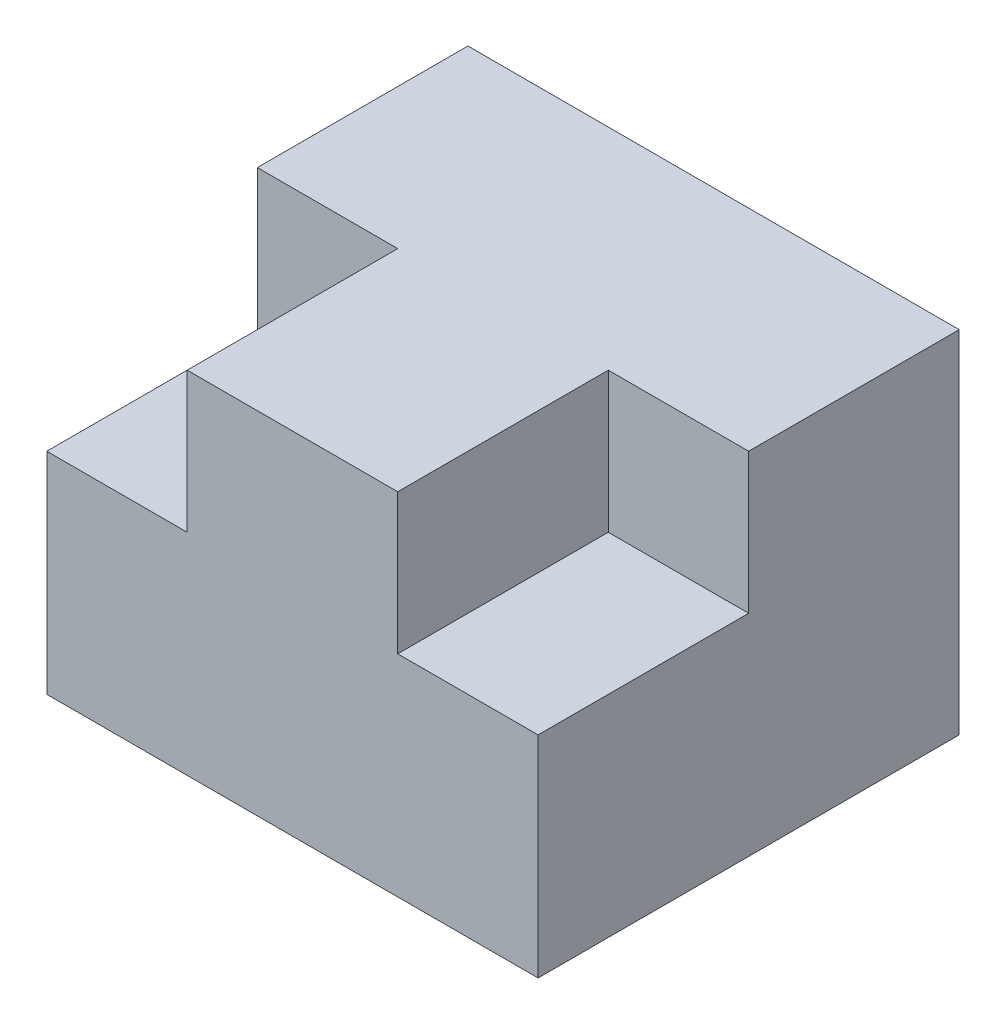
ISO-10303-21;
HEADER;
FILE_DESCRIPTION(('STEP AP214'),'2;1');
FILE_NAME('part.step','',(''),(''),'','','');
FILE_SCHEMA(('AUTOMOTIVE_DESIGN { 1 0 10303 214 1 1 1 1 }'));
ENDSEC;
DATA;
#1=APPLICATION_CONTEXT('core data for automotive mechanical design processes');
#2=APPLICATION_PROTOCOL_DEFINITION('international standard','automotive_design',2000,#1);
#3=PRODUCT_CONTEXT('',#1,'mechanical');
#4=PRODUCT('Part','Part','',(#3));
#5=PRODUCT_RELATED_PRODUCT_CATEGORY('part','',(#4));
#6=PRODUCT_DEFINITION_FORMATION('','',#4);
#7=PRODUCT_DEFINITION_CONTEXT('part definition',#1,'design');
#8=PRODUCT_DEFINITION('design','',#6,#7);
#9=PRODUCT_DEFINITION_SHAPE('','',#8);
#10=(LENGTH_UNIT() NAMED_UNIT(*) SI_UNIT(.MILLI.,.METRE.));
#11=(NAMED_UNIT(*) PLANE_ANGLE_UNIT() SI_UNIT($,.RADIAN.));
#12=(NAMED_UNIT(*) SI_UNIT($,.STERADIAN.) SOLID_ANGLE_UNIT());
#13=UNCERTAINTY_MEASURE_WITH_UNIT(LENGTH_MEASURE(1.E-05),#10,'distance_accuracy_value','');
#14=(GEOMETRIC_REPRESENTATION_CONTEXT(3) GLOBAL_UNCERTAINTY_ASSIGNED_CONTEXT((#13)) GLOBAL_UNIT_ASSIGNED_CONTEXT((#10,
#11,#12)) REPRESENTATION_CONTEXT('',''));
#15=CARTESIAN_POINT('',(0.,0.,0.));
#16=DIRECTION('',(0.,0.,1.));
#17=DIRECTION('',(1.,0.,0.));
#18=AXIS2_PLACEMENT_3D('',#15,#16,#17);
#19=CARTESIAN_POINT('',(0.,15.,15.));
#20=DIRECTION('',(0.,-1.,0.));
#21=DIRECTION('',(1.,0.,0.));
#22=AXIS2_PLACEMENT_3D('',#19,#20,#21);
#23=PLANE('',#22);
#24=DIRECTION('',(-1.,0.,0.));
#25=VECTOR('',#24,1.);
#26=CARTESIAN_POINT('',(0.,15.,0.));
#27=LINE('',#26,#25);
#28=CARTESIAN_POINT('',(10.,15.,0.));
#29=VERTEX_POINT('',#28);
#30=CARTESIAN_POINT('',(0.,15.,0.));
#31=VERTEX_POINT('',#30);
#32=EDGE_CURVE('E162',#29,#31,#27,.T.);
#33=ORIENTED_EDGE('',*,*,#32,.T.);
#34=DIRECTION('',(0.,0.,-1.));
#35=VECTOR('',#34,1.);
#36=CARTESIAN_POINT('',(0.,15.,15.));
#37=LINE('',#36,#35);
#38=CARTESIAN_POINT('',(0.,15.,15.));
#39=VERTEX_POINT('',#38);
#40=EDGE_CURVE('E11',#39,#31,#37,.T.);
#41=ORIENTED_EDGE('',*,*,#40,.F.);
#42=DIRECTION('',(-1.,0.,0.));
#43=VECTOR('',#42,1.);
#44=CARTESIAN_POINT('',(0.,15.,15.));
#45=LINE('',#44,#43);
#46=CARTESIAN_POINT('',(10.,15.,15.));
#47=VERTEX_POINT('',#46);
#48=EDGE_CURVE('E164',#47,#39,#45,.T.);
#49=ORIENTED_EDGE('',*,*,#48,.F.);
#50=DIRECTION('',(0.,0.,-1.));
#51=VECTOR('',#50,1.);
#52=CARTESIAN_POINT('',(10.,15.,15.));
#53=LINE('',#52,#51);
#54=EDGE_CURVE('E188',#47,#29,#53,.T.);
#55=ORIENTED_EDGE('',*,*,#54,.T.);
#56=EDGE_LOOP('',(#33,#41,#49,#55));
#57=FACE_BOUND('',#56,.T.);
#58=ADVANCED_FACE('F43',(#57),#23,.F.);
#59=CARTESIAN_POINT('',(0.,0.,15.));
#60=DIRECTION('',(1.,0.,0.));
#61=DIRECTION('',(0.,1.,0.));
#62=AXIS2_PLACEMENT_3D('',#59,#60,#61);
#63=PLANE('',#62);
#64=ORIENTED_EDGE('',*,*,#40,.T.);
#65=DIRECTION('',(0.,-1.,0.));
#66=VECTOR('',#65,1.);
#67=CARTESIAN_POINT('',(0.,0.,0.));
#68=LINE('',#67,#66);
#69=CARTESIAN_POINT('',(0.,25.,0.));
#70=VERTEX_POINT('',#69);
#71=EDGE_CURVE('E122',#70,#31,#68,.T.);
#72=ORIENTED_EDGE('',*,*,#71,.F.);
#73=DIRECTION('',(0.,0.,1.));
#74=VECTOR('',#73,1.);
#75=CARTESIAN_POINT('',(0.,25.,-15.));
#76=LINE('',#75,#74);
#77=CARTESIAN_POINT('',(0.,25.,-15.));
#78=VERTEX_POINT('',#77);
#79=EDGE_CURVE('E116',#78,#70,#76,.T.);
#80=ORIENTED_EDGE('',*,*,#79,.F.);
#81=DIRECTION('',(0.,-1.,0.));
#82=VECTOR('',#81,1.);
#83=CARTESIAN_POINT('',(0.,0.,-15.));
#84=LINE('',#83,#82);
#85=CARTESIAN_POINT('',(0.,0.,-15.));
#86=VERTEX_POINT('',#85);
#87=EDGE_CURVE('E121',#78,#86,#84,.T.);
#88=ORIENTED_EDGE('',*,*,#87,.T.);
#89=DIRECTION('',(0.,0.,-1.));
#90=VECTOR('',#89,1.);
#91=CARTESIAN_POINT('',(0.,0.,15.));
#92=LINE('',#91,#90);
#93=CARTESIAN_POINT('',(0.,0.,15.));
#94=VERTEX_POINT('',#93);
#95=EDGE_CURVE('E52',#94,#86,#92,.T.);
#96=ORIENTED_EDGE('',*,*,#95,.F.);
#97=DIRECTION('',(0.,-1.,0.));
#98=VECTOR('',#97,1.);
#99=CARTESIAN_POINT('',(0.,0.,15.));
#100=LINE('',#99,#98);
#101=EDGE_CURVE('E167',#39,#94,#100,.T.);
#102=ORIENTED_EDGE('',*,*,#101,.F.);
#103=EDGE_LOOP('',(#64,#72,#80,#88,#96,#102));
#104=FACE_BOUND('',#103,.T.);
#105=ADVANCED_FACE('F118',(#104),#63,.F.);
#106=CARTESIAN_POINT('',(0.,0.,15.));
#107=DIRECTION('',(0.,1.,0.));
#108=DIRECTION('',(0.,0.,1.));
#109=AXIS2_PLACEMENT_3D('',#106,#107,#108);
#110=PLANE('',#109);
#111=ORIENTED_EDGE('',*,*,#95,.T.);
#112=DIRECTION('',(1.,0.,0.));
#113=VECTOR('',#112,1.);
#114=CARTESIAN_POINT('',(0.,0.,-15.));
#115=LINE('',#114,#113);
#116=CARTESIAN_POINT('',(35.,0.,-15.));
#117=VERTEX_POINT('',#116);
#118=EDGE_CURVE('E144',#86,#117,#115,.T.);
#119=ORIENTED_EDGE('',*,*,#118,.T.);
#120=DIRECTION('',(0.,0.,-1.));
#121=VECTOR('',#120,1.);
#122=CARTESIAN_POINT('',(35.,0.,15.));
#123=LINE('',#122,#121);
#124=CARTESIAN_POINT('',(35.,0.,15.));
#125=VERTEX_POINT('',#124);
#126=EDGE_CURVE('E221',#125,#117,#123,.T.);
#127=ORIENTED_EDGE('',*,*,#126,.F.);
#128=DIRECTION('',(1.,0.,0.));
#129=VECTOR('',#128,1.);
#130=CARTESIAN_POINT('',(0.,0.,15.));
#131=LINE('',#130,#129);
#132=EDGE_CURVE('E171',#94,#125,#131,.T.);
#133=ORIENTED_EDGE('',*,*,#132,.F.);
#134=EDGE_LOOP('',(#111,#119,#127,#133));
#135=FACE_BOUND('',#134,.T.);
#136=ADVANCED_FACE('F226',(#135),#110,.F.);
#137=CARTESIAN_POINT('',(35.,0.,15.));
#138=DIRECTION('',(-1.,0.,0.));
#139=DIRECTION('',(0.,0.,1.));
#140=AXIS2_PLACEMENT_3D('',#137,#138,#139);
#141=PLANE('',#140);
#142=ORIENTED_EDGE('',*,*,#126,.T.);
#143=DIRECTION('',(0.,-1.,0.));
#144=VECTOR('',#143,1.);
#145=CARTESIAN_POINT('',(35.,0.,-15.));
#146=LINE('',#145,#144);
#147=CARTESIAN_POINT('',(35.,25.,-15.));
#148=VERTEX_POINT('',#147);
#149=EDGE_CURVE('E128',#148,#117,#146,.T.);
#150=ORIENTED_EDGE('',*,*,#149,.F.);
#151=DIRECTION('',(0.,0.,1.));
#152=VECTOR('',#151,1.);
#153=CARTESIAN_POINT('',(35.,25.,-15.));
#154=LINE('',#153,#152);
#155=CARTESIAN_POINT('',(35.,25.,0.));
#156=VERTEX_POINT('',#155);
#157=EDGE_CURVE('E127',#148,#156,#154,.T.);
#158=ORIENTED_EDGE('',*,*,#157,.T.);
#159=DIRECTION('',(0.,-1.,0.));
#160=VECTOR('',#159,1.);
#161=CARTESIAN_POINT('',(35.,0.,0.));
#162=LINE('',#161,#160);
#163=CARTESIAN_POINT('',(35.,15.,0.));
#164=VERTEX_POINT('',#163);
#165=EDGE_CURVE('E139',#156,#164,#162,.T.);
#166=ORIENTED_EDGE('',*,*,#165,.T.);
#167=DIRECTION('',(0.,0.,-1.));
#168=VECTOR('',#167,1.);
#169=CARTESIAN_POINT('',(35.,15.,15.));
#170=LINE('',#169,#168);
#171=CARTESIAN_POINT('',(35.,15.,15.));
#172=VERTEX_POINT('',#171);
#173=EDGE_CURVE('E217',#172,#164,#170,.T.);
#174=ORIENTED_EDGE('',*,*,#173,.F.);
#175=DIRECTION('',(0.,1.,0.));
#176=VECTOR('',#175,1.);
#177=CARTESIAN_POINT('',(35.,0.,15.));
#178=LINE('',#177,#176);
#179=EDGE_CURVE('E174',#125,#172,#178,.T.);
#180=ORIENTED_EDGE('',*,*,#179,.F.);
#181=EDGE_LOOP('',(#142,#150,#158,#166,#174,#180));
#182=FACE_BOUND('',#181,.T.);
#183=ADVANCED_FACE('F253',(#182),#141,.F.);
#184=CARTESIAN_POINT('',(0.,15.,15.));
#185=DIRECTION('',(0.,-1.,0.));
#186=DIRECTION('',(0.,0.,-1.));
#187=AXIS2_PLACEMENT_3D('',#184,#185,#186);
#188=PLANE('',#187);
#189=DIRECTION('',(-1.,0.,0.));
#190=VECTOR('',#189,1.);
#191=CARTESIAN_POINT('',(0.,15.,0.));
#192=LINE('',#191,#190);
#193=CARTESIAN_POINT('',(25.,15.,0.));
#194=VERTEX_POINT('',#193);
#195=EDGE_CURVE('E192',#164,#194,#192,.T.);
#196=ORIENTED_EDGE('',*,*,#195,.T.);
#197=DIRECTION('',(0.,0.,-1.));
#198=VECTOR('',#197,1.);
#199=CARTESIAN_POINT('',(25.,15.,15.));
#200=LINE('',#199,#198);
#201=CARTESIAN_POINT('',(25.,15.,15.));
#202=VERTEX_POINT('',#201);
#203=EDGE_CURVE('E213',#202,#194,#200,.T.);
#204=ORIENTED_EDGE('',*,*,#203,.F.);
#205=DIRECTION('',(-1.,0.,0.));
#206=VECTOR('',#205,1.);
#207=CARTESIAN_POINT('',(0.,15.,15.));
#208=LINE('',#207,#206);
#209=EDGE_CURVE('E177',#172,#202,#208,.T.);
#210=ORIENTED_EDGE('',*,*,#209,.F.);
#211=ORIENTED_EDGE('',*,*,#173,.T.);
#212=EDGE_LOOP('',(#196,#204,#210,#211));
#213=FACE_BOUND('',#212,.T.);
#214=ADVANCED_FACE('F249',(#213),#188,.F.);
#215=CARTESIAN_POINT('',(25.,0.,15.));
#216=DIRECTION('',(-1.,0.,0.));
#217=DIRECTION('',(0.,0.,1.));
#218=AXIS2_PLACEMENT_3D('',#215,#216,#217);
#219=PLANE('',#218);
#220=DIRECTION('',(0.,1.,0.));
#221=VECTOR('',#220,1.);
#222=CARTESIAN_POINT('',(25.,0.,0.));
#223=LINE('',#222,#221);
#224=CARTESIAN_POINT('',(25.,25.,0.));
#225=VERTEX_POINT('',#224);
#226=EDGE_CURVE('E196',#194,#225,#223,.T.);
#227=ORIENTED_EDGE('',*,*,#226,.T.);
#228=DIRECTION('',(0.,0.,-1.));
#229=VECTOR('',#228,1.);
#230=CARTESIAN_POINT('',(25.,25.,15.));
#231=LINE('',#230,#229);
#232=CARTESIAN_POINT('',(25.,25.,15.));
#233=VERTEX_POINT('',#232);
#234=EDGE_CURVE('E210',#233,#225,#231,.T.);
#235=ORIENTED_EDGE('',*,*,#234,.F.);
#236=DIRECTION('',(0.,1.,0.));
#237=VECTOR('',#236,1.);
#238=CARTESIAN_POINT('',(25.,0.,15.));
#239=LINE('',#238,#237);
#240=EDGE_CURVE('E180',#202,#233,#239,.T.);
#241=ORIENTED_EDGE('',*,*,#240,.F.);
#242=ORIENTED_EDGE('',*,*,#203,.T.);
#243=EDGE_LOOP('',(#227,#235,#241,#242));
#244=FACE_BOUND('',#243,.T.);
#245=ADVANCED_FACE('F243',(#244),#219,.F.);
#246=CARTESIAN_POINT('',(0.,25.,15.));
#247=DIRECTION('',(0.,-1.,0.));
#248=DIRECTION('',(1.,0.,0.));
#249=AXIS2_PLACEMENT_3D('',#246,#247,#248);
#250=PLANE('',#249);
#251=ORIENTED_EDGE('',*,*,#234,.T.);
#252=DIRECTION('',(1.,0.,0.));
#253=VECTOR('',#252,1.);
#254=CARTESIAN_POINT('',(0.,25.,0.));
#255=LINE('',#254,#253);
#256=EDGE_CURVE('E155',#225,#156,#255,.T.);
#257=ORIENTED_EDGE('',*,*,#256,.T.);
#258=ORIENTED_EDGE('',*,*,#157,.F.);
#259=DIRECTION('',(1.,0.,0.));
#260=VECTOR('',#259,1.);
#261=CARTESIAN_POINT('',(0.,25.,-15.));
#262=LINE('',#261,#260);
#263=EDGE_CURVE('E132',#78,#148,#262,.T.);
#264=ORIENTED_EDGE('',*,*,#263,.F.);
#265=ORIENTED_EDGE('',*,*,#79,.T.);
#266=CARTESIAN_POINT('',(10.,25.,0.));
#267=VERTEX_POINT('',#266);
#268=EDGE_CURVE('E152',#70,#267,#255,.T.);
#269=ORIENTED_EDGE('',*,*,#268,.T.);
#270=DIRECTION('',(0.,0.,-1.));
#271=VECTOR('',#270,1.);
#272=CARTESIAN_POINT('',(10.,25.,15.));
#273=LINE('',#272,#271);
#274=CARTESIAN_POINT('',(10.,25.,15.));
#275=VERTEX_POINT('',#274);
#276=EDGE_CURVE('E206',#275,#267,#273,.T.);
#277=ORIENTED_EDGE('',*,*,#276,.F.);
#278=DIRECTION('',(-1.,0.,0.));
#279=VECTOR('',#278,1.);
#280=CARTESIAN_POINT('',(0.,25.,15.));
#281=LINE('',#280,#279);
#282=EDGE_CURVE('E183',#233,#275,#281,.T.);
#283=ORIENTED_EDGE('',*,*,#282,.F.);
#284=EDGE_LOOP('',(#251,#257,#258,#264,#265,#269,#277,#283));
#285=FACE_BOUND('',#284,.T.);
#286=ADVANCED_FACE('F134',(#285),#250,.F.);
#287=CARTESIAN_POINT('',(10.,0.,15.));
#288=DIRECTION('',(1.,0.,0.));
#289=DIRECTION('',(0.,1.,0.));
#290=AXIS2_PLACEMENT_3D('',#287,#288,#289);
#291=PLANE('',#290);
#292=DIRECTION('',(0.,-1.,0.));
#293=VECTOR('',#292,1.);
#294=CARTESIAN_POINT('',(10.,0.,0.));
#295=LINE('',#294,#293);
#296=EDGE_CURVE('E168',#267,#29,#295,.T.);
#297=ORIENTED_EDGE('',*,*,#296,.T.);
#298=ORIENTED_EDGE('',*,*,#54,.F.);
#299=DIRECTION('',(0.,-1.,0.));
#300=VECTOR('',#299,1.);
#301=CARTESIAN_POINT('',(10.,0.,15.));
#302=LINE('',#301,#300);
#303=EDGE_CURVE('E59',#275,#47,#302,.T.);
#304=ORIENTED_EDGE('',*,*,#303,.F.);
#305=ORIENTED_EDGE('',*,*,#276,.T.);
#306=EDGE_LOOP('',(#297,#298,#304,#305));
#307=FACE_BOUND('',#306,.T.);
#308=ADVANCED_FACE('F235',(#307),#291,.F.);
#309=CARTESIAN_POINT('',(0.,0.,15.));
#310=DIRECTION('',(0.,0.,1.));
#311=DIRECTION('',(1.,0.,0.));
#312=AXIS2_PLACEMENT_3D('',#309,#310,#311);
#313=PLANE('',#312);
#314=ORIENTED_EDGE('',*,*,#48,.T.);
#315=ORIENTED_EDGE('',*,*,#101,.T.);
#316=ORIENTED_EDGE('',*,*,#132,.T.);
#317=ORIENTED_EDGE('',*,*,#179,.T.);
#318=ORIENTED_EDGE('',*,*,#209,.T.);
#319=ORIENTED_EDGE('',*,*,#240,.T.);
#320=ORIENTED_EDGE('',*,*,#282,.T.);
#321=ORIENTED_EDGE('',*,*,#303,.T.);
#322=EDGE_LOOP('',(#314,#315,#316,#317,#318,#319,#320,#321));
#323=FACE_BOUND('',#322,.T.);
#324=ADVANCED_FACE('F230',(#323),#313,.T.);
#325=CARTESIAN_POINT('',(0.,0.,0.));
#326=DIRECTION('',(0.,0.,1.));
#327=DIRECTION('',(1.,0.,0.));
#328=AXIS2_PLACEMENT_3D('',#325,#326,#327);
#329=PLANE('',#328);
#330=ORIENTED_EDGE('',*,*,#32,.F.);
#331=ORIENTED_EDGE('',*,*,#296,.F.);
#332=ORIENTED_EDGE('',*,*,#268,.F.);
#333=ORIENTED_EDGE('',*,*,#71,.T.);
#334=EDGE_LOOP('',(#330,#331,#332,#333));
#335=FACE_BOUND('',#334,.T.);
#336=ADVANCED_FACE('F233',(#335),#329,.T.);
#337=ORIENTED_EDGE('',*,*,#226,.F.);
#338=ORIENTED_EDGE('',*,*,#195,.F.);
#339=ORIENTED_EDGE('',*,*,#165,.F.);
#340=ORIENTED_EDGE('',*,*,#256,.F.);
#341=EDGE_LOOP('',(#337,#338,#339,#340));
#342=FACE_BOUND('',#341,.T.);
#343=ADVANCED_FACE('F246',(#342),#329,.T.);
#344=CARTESIAN_POINT('',(0.,0.,-15.));
#345=DIRECTION('',(0.,0.,1.));
#346=DIRECTION('',(1.,0.,0.));
#347=AXIS2_PLACEMENT_3D('',#344,#345,#346);
#348=PLANE('',#347);
#349=ORIENTED_EDGE('',*,*,#263,.T.);
#350=ORIENTED_EDGE('',*,*,#149,.T.);
#351=ORIENTED_EDGE('',*,*,#118,.F.);
#352=ORIENTED_EDGE('',*,*,#87,.F.);
#353=EDGE_LOOP('',(#349,#350,#351,#352));
#354=FACE_BOUND('',#353,.T.);
#355=ADVANCED_FACE('F142',(#354),#348,.F.);
#356=CLOSED_SHELL('',(#58,#105,#136,#183,#214,#245,#286,#308,#324,#336,#343,#355));
#357=MANIFOLD_SOLID_BREP('B2',#356);
#358=ADVANCED_BREP_SHAPE_REPRESENTATION('',(#18,#357),#14);
#359=SHAPE_DEFINITION_REPRESENTATION(#9,#358);
ENDSEC;
END-ISO-10303-21;
